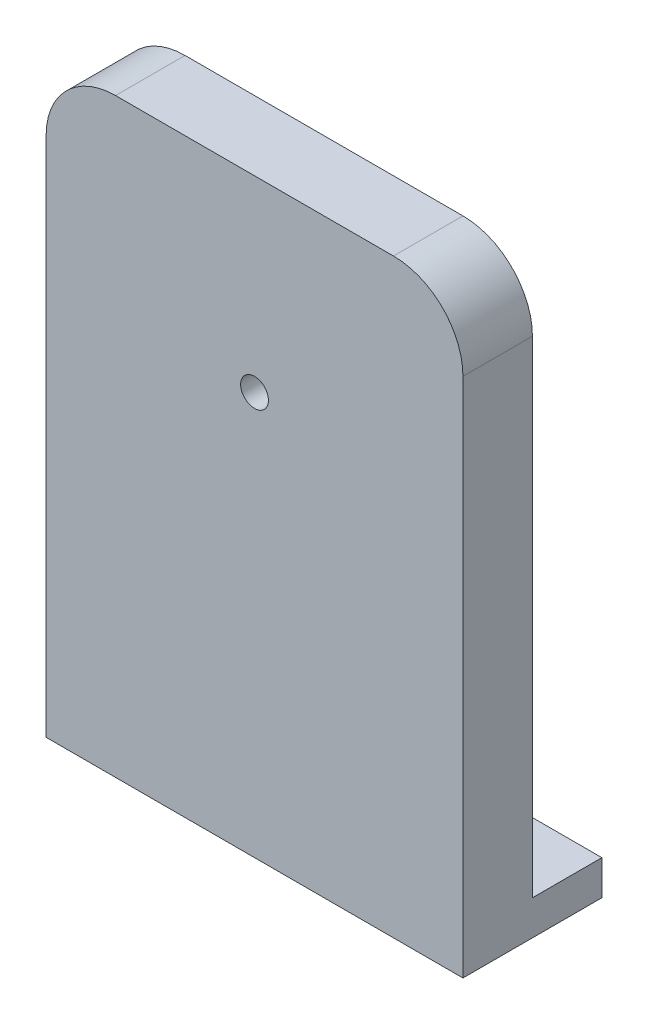
ISO-10303-21;
HEADER;
FILE_DESCRIPTION(('STEP AP214'),'2;1');
FILE_NAME('part.step','',(''),(''),'','','');
FILE_SCHEMA(('AUTOMOTIVE_DESIGN { 1 0 10303 214 1 1 1 1 }'));
ENDSEC;
DATA;
#1=APPLICATION_CONTEXT('core data for automotive mechanical design processes');
#2=APPLICATION_PROTOCOL_DEFINITION('international standard','automotive_design',2000,#1);
#3=PRODUCT_CONTEXT('',#1,'mechanical');
#4=PRODUCT('Part','Part','',(#3));
#5=PRODUCT_RELATED_PRODUCT_CATEGORY('part','',(#4));
#6=PRODUCT_DEFINITION_FORMATION('','',#4);
#7=PRODUCT_DEFINITION_CONTEXT('part definition',#1,'design');
#8=PRODUCT_DEFINITION('design','',#6,#7);
#9=PRODUCT_DEFINITION_SHAPE('','',#8);
#10=(LENGTH_UNIT() NAMED_UNIT(*) SI_UNIT(.MILLI.,.METRE.));
#11=(NAMED_UNIT(*) PLANE_ANGLE_UNIT() SI_UNIT($,.RADIAN.));
#12=(NAMED_UNIT(*) SI_UNIT($,.STERADIAN.) SOLID_ANGLE_UNIT());
#13=UNCERTAINTY_MEASURE_WITH_UNIT(LENGTH_MEASURE(1.E-05),#10,'distance_accuracy_value','');
#14=(GEOMETRIC_REPRESENTATION_CONTEXT(3) GLOBAL_UNCERTAINTY_ASSIGNED_CONTEXT((#13)) GLOBAL_UNIT_ASSIGNED_CONTEXT((#10,
#11,#12)) REPRESENTATION_CONTEXT('',''));
#15=CARTESIAN_POINT('',(0.,0.,0.));
#16=DIRECTION('',(0.,0.,1.));
#17=DIRECTION('',(1.,0.,0.));
#18=AXIS2_PLACEMENT_3D('',#15,#16,#17);
#19=CARTESIAN_POINT('',(0.,5.,0.));
#20=DIRECTION('',(0.,1.,0.));
#21=DIRECTION('',(0.,0.,1.));
#22=AXIS2_PLACEMENT_3D('',#19,#20,#21);
#23=PLANE('',#22);
#24=DIRECTION('',(-1.,0.,0.));
#25=VECTOR('',#24,1.);
#26=CARTESIAN_POINT('',(-30.,5.,0.));
#27=LINE('',#26,#25);
#28=CARTESIAN_POINT('',(30.,5.,0.));
#29=VERTEX_POINT('',#28);
#30=CARTESIAN_POINT('',(-30.,5.,0.));
#31=VERTEX_POINT('',#30);
#32=EDGE_CURVE('E162',#29,#31,#27,.T.);
#33=ORIENTED_EDGE('',*,*,#32,.F.);
#34=DIRECTION('',(0.,0.,-1.));
#35=VECTOR('',#34,1.);
#36=CARTESIAN_POINT('',(30.,5.,-10.));
#37=LINE('',#36,#35);
#38=CARTESIAN_POINT('',(30.,5.,-10.));
#39=VERTEX_POINT('',#38);
#40=EDGE_CURVE('E253',#29,#39,#37,.T.);
#41=ORIENTED_EDGE('',*,*,#40,.T.);
#42=DIRECTION('',(-1.,0.,0.));
#43=VECTOR('',#42,1.);
#44=CARTESIAN_POINT('',(-30.,5.,-10.));
#45=LINE('',#44,#43);
#46=CARTESIAN_POINT('',(-30.,5.,-10.));
#47=VERTEX_POINT('',#46);
#48=EDGE_CURVE('E165',#39,#47,#45,.T.);
#49=ORIENTED_EDGE('',*,*,#48,.T.);
#50=DIRECTION('',(0.,0.,1.));
#51=VECTOR('',#50,1.);
#52=CARTESIAN_POINT('',(-30.,5.,-10.));
#53=LINE('',#52,#51);
#54=EDGE_CURVE('E151',#47,#31,#53,.T.);
#55=ORIENTED_EDGE('',*,*,#54,.T.);
#56=EDGE_LOOP('',(#33,#41,#49,#55));
#57=FACE_BOUND('',#56,.T.);
#58=DIRECTION('',(1.,0.,0.));
#59=VECTOR('',#58,1.);
#60=CARTESIAN_POINT('',(-16.8,5.,-1.6));
#61=LINE('',#60,#59);
#62=CARTESIAN_POINT('',(-16.8,5.,-1.6));
#63=VERTEX_POINT('',#62);
#64=CARTESIAN_POINT('',(-5.,5.,-1.6));
#65=VERTEX_POINT('',#64);
#66=EDGE_CURVE('E222',#63,#65,#61,.T.);
#67=ORIENTED_EDGE('',*,*,#66,.F.);
#68=CARTESIAN_POINT('',(-16.8,5.,-5.));
#69=DIRECTION('',(0.,1.,0.));
#70=DIRECTION('',(0.,0.,1.));
#71=AXIS2_PLACEMENT_3D('',#68,#69,#70);
#72=CIRCLE('',#71,3.4);
#73=CARTESIAN_POINT('',(-16.8,5.,-8.4));
#74=VERTEX_POINT('',#73);
#75=EDGE_CURVE('E220',#74,#63,#72,.T.);
#76=ORIENTED_EDGE('',*,*,#75,.F.);
#77=DIRECTION('',(-1.,0.,0.));
#78=VECTOR('',#77,1.);
#79=CARTESIAN_POINT('',(-16.8,5.,-8.4));
#80=LINE('',#79,#78);
#81=CARTESIAN_POINT('',(-5.,5.,-8.4));
#82=VERTEX_POINT('',#81);
#83=EDGE_CURVE('E228',#82,#74,#80,.T.);
#84=ORIENTED_EDGE('',*,*,#83,.F.);
#85=CARTESIAN_POINT('',(-5.,5.,-5.));
#86=DIRECTION('',(0.,1.,0.));
#87=DIRECTION('',(0.,0.,1.));
#88=AXIS2_PLACEMENT_3D('',#85,#86,#87);
#89=CIRCLE('',#88,3.4);
#90=EDGE_CURVE('E225',#65,#82,#89,.T.);
#91=ORIENTED_EDGE('',*,*,#90,.F.);
#92=EDGE_LOOP('',(#67,#76,#84,#91));
#93=FACE_BOUND('',#92,.T.);
#94=DIRECTION('',(1.,0.,0.));
#95=VECTOR('',#94,1.);
#96=CARTESIAN_POINT('',(3.19999999999999,5.,-1.6));
#97=LINE('',#96,#95);
#98=CARTESIAN_POINT('',(3.19999999999999,5.,-1.6));
#99=VERTEX_POINT('',#98);
#100=CARTESIAN_POINT('',(15.,5.,-1.6));
#101=VERTEX_POINT('',#100);
#102=EDGE_CURVE('E190',#99,#101,#97,.T.);
#103=ORIENTED_EDGE('',*,*,#102,.F.);
#104=CARTESIAN_POINT('',(3.19999999999999,5.,-5.));
#105=DIRECTION('',(0.,1.,0.));
#106=DIRECTION('',(0.,0.,1.));
#107=AXIS2_PLACEMENT_3D('',#104,#105,#106);
#108=CIRCLE('',#107,3.4);
#109=CARTESIAN_POINT('',(3.19999999999999,5.,-8.4));
#110=VERTEX_POINT('',#109);
#111=EDGE_CURVE('E188',#110,#99,#108,.T.);
#112=ORIENTED_EDGE('',*,*,#111,.F.);
#113=DIRECTION('',(-1.,0.,0.));
#114=VECTOR('',#113,1.);
#115=CARTESIAN_POINT('',(3.19999999999999,5.,-8.4));
#116=LINE('',#115,#114);
#117=CARTESIAN_POINT('',(15.,5.,-8.4));
#118=VERTEX_POINT('',#117);
#119=EDGE_CURVE('E196',#118,#110,#116,.T.);
#120=ORIENTED_EDGE('',*,*,#119,.F.);
#121=CARTESIAN_POINT('',(15.,5.,-5.));
#122=DIRECTION('',(0.,1.,0.));
#123=DIRECTION('',(0.,0.,1.));
#124=AXIS2_PLACEMENT_3D('',#121,#122,#123);
#125=CIRCLE('',#124,3.4);
#126=EDGE_CURVE('E193',#101,#118,#125,.T.);
#127=ORIENTED_EDGE('',*,*,#126,.F.);
#128=EDGE_LOOP('',(#103,#112,#120,#127));
#129=FACE_BOUND('',#128,.T.);
#130=ADVANCED_FACE('F34',(#57,#93,#129),#23,.T.);
#131=CARTESIAN_POINT('',(0.,0.,0.));
#132=DIRECTION('',(0.,1.,0.));
#133=DIRECTION('',(0.,0.,1.));
#134=AXIS2_PLACEMENT_3D('',#131,#132,#133);
#135=PLANE('',#134);
#136=CARTESIAN_POINT('',(-16.8,0.,-5.));
#137=DIRECTION('',(0.,1.,0.));
#138=DIRECTION('',(0.,0.,1.));
#139=AXIS2_PLACEMENT_3D('',#136,#137,#138);
#140=CIRCLE('',#139,3.4);
#141=CARTESIAN_POINT('',(-16.8,0.,-8.4));
#142=VERTEX_POINT('',#141);
#143=CARTESIAN_POINT('',(-16.8,0.,-1.6));
#144=VERTEX_POINT('',#143);
#145=EDGE_CURVE('E219',#142,#144,#140,.T.);
#146=ORIENTED_EDGE('',*,*,#145,.T.);
#147=DIRECTION('',(1.,0.,0.));
#148=VECTOR('',#147,1.);
#149=CARTESIAN_POINT('',(-16.8,0.,-1.6));
#150=LINE('',#149,#148);
#151=CARTESIAN_POINT('',(-5.,0.,-1.6));
#152=VERTEX_POINT('',#151);
#153=EDGE_CURVE('E233',#144,#152,#150,.T.);
#154=ORIENTED_EDGE('',*,*,#153,.T.);
#155=CARTESIAN_POINT('',(-5.,0.,-5.));
#156=DIRECTION('',(0.,1.,0.));
#157=DIRECTION('',(0.,0.,1.));
#158=AXIS2_PLACEMENT_3D('',#155,#156,#157);
#159=CIRCLE('',#158,3.4);
#160=CARTESIAN_POINT('',(-5.,0.,-8.4));
#161=VERTEX_POINT('',#160);
#162=EDGE_CURVE('E236',#152,#161,#159,.T.);
#163=ORIENTED_EDGE('',*,*,#162,.T.);
#164=DIRECTION('',(-1.,0.,0.));
#165=VECTOR('',#164,1.);
#166=CARTESIAN_POINT('',(-16.8,0.,-8.4));
#167=LINE('',#166,#165);
#168=EDGE_CURVE('E223',#161,#142,#167,.T.);
#169=ORIENTED_EDGE('',*,*,#168,.T.);
#170=EDGE_LOOP('',(#146,#154,#163,#169));
#171=FACE_BOUND('',#170,.T.);
#172=DIRECTION('',(0.,0.,-1.));
#173=VECTOR('',#172,1.);
#174=CARTESIAN_POINT('',(30.,0.,-10.));
#175=LINE('',#174,#173);
#176=CARTESIAN_POINT('',(30.,0.,10.));
#177=VERTEX_POINT('',#176);
#178=CARTESIAN_POINT('',(30.,0.,-10.));
#179=VERTEX_POINT('',#178);
#180=EDGE_CURVE('E250',#177,#179,#175,.T.);
#181=ORIENTED_EDGE('',*,*,#180,.F.);
#182=DIRECTION('',(1.,0.,0.));
#183=VECTOR('',#182,1.);
#184=CARTESIAN_POINT('',(-30.,0.,10.));
#185=LINE('',#184,#183);
#186=CARTESIAN_POINT('',(-30.,0.,10.));
#187=VERTEX_POINT('',#186);
#188=EDGE_CURVE('E255',#187,#177,#185,.T.);
#189=ORIENTED_EDGE('',*,*,#188,.F.);
#190=DIRECTION('',(0.,0.,1.));
#191=VECTOR('',#190,1.);
#192=CARTESIAN_POINT('',(-30.,0.,-10.));
#193=LINE('',#192,#191);
#194=CARTESIAN_POINT('',(-30.,0.,-10.));
#195=VERTEX_POINT('',#194);
#196=EDGE_CURVE('E267',#195,#187,#193,.T.);
#197=ORIENTED_EDGE('',*,*,#196,.F.);
#198=DIRECTION('',(-1.,0.,0.));
#199=VECTOR('',#198,1.);
#200=CARTESIAN_POINT('',(-30.,0.,-10.));
#201=LINE('',#200,#199);
#202=EDGE_CURVE('E270',#179,#195,#201,.T.);
#203=ORIENTED_EDGE('',*,*,#202,.F.);
#204=EDGE_LOOP('',(#181,#189,#197,#203));
#205=FACE_BOUND('',#204,.T.);
#206=CARTESIAN_POINT('',(3.19999999999999,0.,-5.));
#207=DIRECTION('',(0.,1.,0.));
#208=DIRECTION('',(0.,0.,1.));
#209=AXIS2_PLACEMENT_3D('',#206,#207,#208);
#210=CIRCLE('',#209,3.4);
#211=CARTESIAN_POINT('',(3.19999999999999,0.,-8.4));
#212=VERTEX_POINT('',#211);
#213=CARTESIAN_POINT('',(3.19999999999999,0.,-1.6));
#214=VERTEX_POINT('',#213);
#215=EDGE_CURVE('E199',#212,#214,#210,.T.);
#216=ORIENTED_EDGE('',*,*,#215,.T.);
#217=DIRECTION('',(1.,0.,0.));
#218=VECTOR('',#217,1.);
#219=CARTESIAN_POINT('',(3.19999999999999,0.,-1.6));
#220=LINE('',#219,#218);
#221=CARTESIAN_POINT('',(15.,0.,-1.6));
#222=VERTEX_POINT('',#221);
#223=EDGE_CURVE('E202',#214,#222,#220,.T.);
#224=ORIENTED_EDGE('',*,*,#223,.T.);
#225=CARTESIAN_POINT('',(15.,0.,-5.));
#226=DIRECTION('',(0.,1.,0.));
#227=DIRECTION('',(0.,0.,1.));
#228=AXIS2_PLACEMENT_3D('',#225,#226,#227);
#229=CIRCLE('',#228,3.4);
#230=CARTESIAN_POINT('',(15.,0.,-8.4));
#231=VERTEX_POINT('',#230);
#232=EDGE_CURVE('E205',#222,#231,#229,.T.);
#233=ORIENTED_EDGE('',*,*,#232,.T.);
#234=DIRECTION('',(-1.,0.,0.));
#235=VECTOR('',#234,1.);
#236=CARTESIAN_POINT('',(3.19999999999999,0.,-8.4));
#237=LINE('',#236,#235);
#238=EDGE_CURVE('E191',#231,#212,#237,.T.);
#239=ORIENTED_EDGE('',*,*,#238,.T.);
#240=EDGE_LOOP('',(#216,#224,#233,#239));
#241=FACE_BOUND('',#240,.T.);
#242=ADVANCED_FACE('F279',(#171,#205,#241),#135,.F.);
#243=CARTESIAN_POINT('',(30.,5.,-10.));
#244=DIRECTION('',(-1.,0.,0.));
#245=DIRECTION('',(0.,0.,1.));
#246=AXIS2_PLACEMENT_3D('',#243,#244,#245);
#247=PLANE('',#246);
#248=DIRECTION('',(0.,-1.,0.));
#249=VECTOR('',#248,1.);
#250=CARTESIAN_POINT('',(30.,85.,0.));
#251=LINE('',#250,#249);
#252=CARTESIAN_POINT('',(30.,75.,0.));
#253=VERTEX_POINT('',#252);
#254=EDGE_CURVE('E156',#253,#29,#251,.T.);
#255=ORIENTED_EDGE('',*,*,#254,.F.);
#256=DIRECTION('',(0.,0.,-1.));
#257=VECTOR('',#256,1.);
#258=CARTESIAN_POINT('',(30.,75.,-10.));
#259=LINE('',#258,#257);
#260=CARTESIAN_POINT('',(30.,75.,10.));
#261=VERTEX_POINT('',#260);
#262=EDGE_CURVE('E57',#253,#261,#259,.F.);
#263=ORIENTED_EDGE('',*,*,#262,.T.);
#264=DIRECTION('',(0.,-1.,0.));
#265=VECTOR('',#264,1.);
#266=CARTESIAN_POINT('',(30.,5.,10.));
#267=LINE('',#266,#265);
#268=EDGE_CURVE('E167',#261,#177,#267,.T.);
#269=ORIENTED_EDGE('',*,*,#268,.T.);
#270=ORIENTED_EDGE('',*,*,#180,.T.);
#271=DIRECTION('',(0.,-1.,0.));
#272=VECTOR('',#271,1.);
#273=CARTESIAN_POINT('',(30.,5.,-10.));
#274=LINE('',#273,#272);
#275=EDGE_CURVE('E256',#39,#179,#274,.T.);
#276=ORIENTED_EDGE('',*,*,#275,.F.);
#277=ORIENTED_EDGE('',*,*,#40,.F.);
#278=EDGE_LOOP('',(#255,#263,#269,#270,#276,#277));
#279=FACE_BOUND('',#278,.T.);
#280=ADVANCED_FACE('F276',(#279),#247,.F.);
#281=CARTESIAN_POINT('',(-30.,5.,-10.));
#282=DIRECTION('',(0.,0.,1.));
#283=DIRECTION('',(1.,0.,0.));
#284=AXIS2_PLACEMENT_3D('',#281,#282,#283);
#285=PLANE('',#284);
#286=ORIENTED_EDGE('',*,*,#202,.T.);
#287=DIRECTION('',(0.,-1.,0.));
#288=VECTOR('',#287,1.);
#289=CARTESIAN_POINT('',(-30.,5.,-10.));
#290=LINE('',#289,#288);
#291=EDGE_CURVE('E260',#47,#195,#290,.T.);
#292=ORIENTED_EDGE('',*,*,#291,.F.);
#293=ORIENTED_EDGE('',*,*,#48,.F.);
#294=ORIENTED_EDGE('',*,*,#275,.T.);
#295=EDGE_LOOP('',(#286,#292,#293,#294));
#296=FACE_BOUND('',#295,.T.);
#297=ADVANCED_FACE('F283',(#296),#285,.F.);
#298=CARTESIAN_POINT('',(-30.,5.,-10.));
#299=DIRECTION('',(1.,0.,0.));
#300=DIRECTION('',(0.,0.,-1.));
#301=AXIS2_PLACEMENT_3D('',#298,#299,#300);
#302=PLANE('',#301);
#303=DIRECTION('',(0.,-1.,0.));
#304=VECTOR('',#303,1.);
#305=CARTESIAN_POINT('',(-30.,5.,10.));
#306=LINE('',#305,#304);
#307=CARTESIAN_POINT('',(-30.,75.,10.));
#308=VERTEX_POINT('',#307);
#309=EDGE_CURVE('E262',#308,#187,#306,.T.);
#310=ORIENTED_EDGE('',*,*,#309,.F.);
#311=DIRECTION('',(0.,0.,1.));
#312=VECTOR('',#311,1.);
#313=CARTESIAN_POINT('',(-30.,75.,-10.));
#314=LINE('',#313,#312);
#315=CARTESIAN_POINT('',(-30.,75.,0.));
#316=VERTEX_POINT('',#315);
#317=EDGE_CURVE('E11',#308,#316,#314,.F.);
#318=ORIENTED_EDGE('',*,*,#317,.T.);
#319=DIRECTION('',(0.,-1.,0.));
#320=VECTOR('',#319,1.);
#321=CARTESIAN_POINT('',(-30.,85.,0.));
#322=LINE('',#321,#320);
#323=EDGE_CURVE('E147',#316,#31,#322,.T.);
#324=ORIENTED_EDGE('',*,*,#323,.T.);
#325=ORIENTED_EDGE('',*,*,#54,.F.);
#326=ORIENTED_EDGE('',*,*,#291,.T.);
#327=ORIENTED_EDGE('',*,*,#196,.T.);
#328=EDGE_LOOP('',(#310,#318,#324,#325,#326,#327));
#329=FACE_BOUND('',#328,.T.);
#330=ADVANCED_FACE('F149',(#329),#302,.F.);
#331=CARTESIAN_POINT('',(-30.,5.,10.));
#332=DIRECTION('',(0.,0.,-1.));
#333=DIRECTION('',(-1.,0.,0.));
#334=AXIS2_PLACEMENT_3D('',#331,#332,#333);
#335=PLANE('',#334);
#336=CARTESIAN_POINT('',(0.,58.,10.));
#337=DIRECTION('',(0.,0.,-1.));
#338=DIRECTION('',(-1.,0.,0.));
#339=AXIS2_PLACEMENT_3D('',#336,#337,#338);
#340=CIRCLE('',#339,2.);
#341=CARTESIAN_POINT('',(-2.,58.,10.));
#342=VERTEX_POINT('',#341);
#343=EDGE_CURVE('E461',#342,#342,#340,.T.);
#344=ORIENTED_EDGE('',*,*,#343,.T.);
#345=EDGE_LOOP('',(#344));
#346=FACE_BOUND('',#345,.T.);
#347=ORIENTED_EDGE('',*,*,#268,.F.);
#348=CARTESIAN_POINT('',(20.,75.,10.));
#349=DIRECTION('',(0.,0.,-1.));
#350=DIRECTION('',(-1.,0.,0.));
#351=AXIS2_PLACEMENT_3D('',#348,#349,#350);
#352=CIRCLE('',#351,10.);
#353=CARTESIAN_POINT('',(20.,85.,10.));
#354=VERTEX_POINT('',#353);
#355=EDGE_CURVE('E42',#261,#354,#352,.F.);
#356=ORIENTED_EDGE('',*,*,#355,.T.);
#357=DIRECTION('',(1.,0.,0.));
#358=VECTOR('',#357,1.);
#359=CARTESIAN_POINT('',(30.,85.,10.));
#360=LINE('',#359,#358);
#361=CARTESIAN_POINT('',(-20.,85.,10.));
#362=VERTEX_POINT('',#361);
#363=EDGE_CURVE('E171',#362,#354,#360,.T.);
#364=ORIENTED_EDGE('',*,*,#363,.F.);
#365=CARTESIAN_POINT('',(-20.,75.,10.));
#366=DIRECTION('',(0.,0.,-1.));
#367=DIRECTION('',(-1.,0.,0.));
#368=AXIS2_PLACEMENT_3D('',#365,#366,#367);
#369=CIRCLE('',#368,10.);
#370=EDGE_CURVE('E49',#362,#308,#369,.F.);
#371=ORIENTED_EDGE('',*,*,#370,.T.);
#372=ORIENTED_EDGE('',*,*,#309,.T.);
#373=ORIENTED_EDGE('',*,*,#188,.T.);
#374=EDGE_LOOP('',(#347,#356,#364,#371,#372,#373));
#375=FACE_BOUND('',#374,.T.);
#376=ADVANCED_FACE('F299',(#346,#375),#335,.F.);
#377=CARTESIAN_POINT('',(-16.8,5.,-5.));
#378=DIRECTION('',(0.,-1.,0.));
#379=DIRECTION('',(0.,0.,-1.));
#380=AXIS2_PLACEMENT_3D('',#377,#378,#379);
#381=CYLINDRICAL_SURFACE('',#380,3.4);
#382=ORIENTED_EDGE('',*,*,#145,.F.);
#383=DIRECTION('',(0.,-1.,0.));
#384=VECTOR('',#383,1.);
#385=CARTESIAN_POINT('',(-16.8,5.,-8.4));
#386=LINE('',#385,#384);
#387=EDGE_CURVE('E230',#74,#142,#386,.T.);
#388=ORIENTED_EDGE('',*,*,#387,.F.);
#389=ORIENTED_EDGE('',*,*,#75,.T.);
#390=DIRECTION('',(0.,-1.,0.));
#391=VECTOR('',#390,1.);
#392=CARTESIAN_POINT('',(-16.8,5.,-1.6));
#393=LINE('',#392,#391);
#394=EDGE_CURVE('E247',#63,#144,#393,.T.);
#395=ORIENTED_EDGE('',*,*,#394,.T.);
#396=EDGE_LOOP('',(#382,#388,#389,#395));
#397=FACE_BOUND('',#396,.T.);
#398=ADVANCED_FACE('F324',(#397),#381,.F.);
#399=CARTESIAN_POINT('',(-16.8,5.,-1.6));
#400=DIRECTION('',(0.,0.,-1.));
#401=DIRECTION('',(-1.,0.,0.));
#402=AXIS2_PLACEMENT_3D('',#399,#400,#401);
#403=PLANE('',#402);
#404=ORIENTED_EDGE('',*,*,#153,.F.);
#405=ORIENTED_EDGE('',*,*,#394,.F.);
#406=ORIENTED_EDGE('',*,*,#66,.T.);
#407=DIRECTION('',(0.,-1.,0.));
#408=VECTOR('',#407,1.);
#409=CARTESIAN_POINT('',(-5.,5.,-1.6));
#410=LINE('',#409,#408);
#411=EDGE_CURVE('E245',#65,#152,#410,.T.);
#412=ORIENTED_EDGE('',*,*,#411,.T.);
#413=EDGE_LOOP('',(#404,#405,#406,#412));
#414=FACE_BOUND('',#413,.T.);
#415=ADVANCED_FACE('F360',(#414),#403,.T.);
#416=CARTESIAN_POINT('',(-5.,5.,-5.));
#417=DIRECTION('',(0.,-1.,0.));
#418=DIRECTION('',(0.,0.,-1.));
#419=AXIS2_PLACEMENT_3D('',#416,#417,#418);
#420=CYLINDRICAL_SURFACE('',#419,3.4);
#421=ORIENTED_EDGE('',*,*,#162,.F.);
#422=ORIENTED_EDGE('',*,*,#411,.F.);
#423=ORIENTED_EDGE('',*,*,#90,.T.);
#424=DIRECTION('',(0.,-1.,0.));
#425=VECTOR('',#424,1.);
#426=CARTESIAN_POINT('',(-5.,5.,-8.4));
#427=LINE('',#426,#425);
#428=EDGE_CURVE('E243',#82,#161,#427,.T.);
#429=ORIENTED_EDGE('',*,*,#428,.T.);
#430=EDGE_LOOP('',(#421,#422,#423,#429));
#431=FACE_BOUND('',#430,.T.);
#432=ADVANCED_FACE('F367',(#431),#420,.F.);
#433=CARTESIAN_POINT('',(-16.8,5.,-8.4));
#434=DIRECTION('',(0.,0.,1.));
#435=DIRECTION('',(1.,0.,0.));
#436=AXIS2_PLACEMENT_3D('',#433,#434,#435);
#437=PLANE('',#436);
#438=ORIENTED_EDGE('',*,*,#168,.F.);
#439=ORIENTED_EDGE('',*,*,#428,.F.);
#440=ORIENTED_EDGE('',*,*,#83,.T.);
#441=ORIENTED_EDGE('',*,*,#387,.T.);
#442=EDGE_LOOP('',(#438,#439,#440,#441));
#443=FACE_BOUND('',#442,.T.);
#444=ADVANCED_FACE('F374',(#443),#437,.T.);
#445=CARTESIAN_POINT('',(3.19999999999999,5.,-5.));
#446=DIRECTION('',(0.,-1.,0.));
#447=DIRECTION('',(0.,0.,-1.));
#448=AXIS2_PLACEMENT_3D('',#445,#446,#447);
#449=CYLINDRICAL_SURFACE('',#448,3.4);
#450=ORIENTED_EDGE('',*,*,#215,.F.);
#451=DIRECTION('',(0.,-1.,0.));
#452=VECTOR('',#451,1.);
#453=CARTESIAN_POINT('',(3.19999999999999,5.,-8.4));
#454=LINE('',#453,#452);
#455=EDGE_CURVE('E198',#110,#212,#454,.T.);
#456=ORIENTED_EDGE('',*,*,#455,.F.);
#457=ORIENTED_EDGE('',*,*,#111,.T.);
#458=DIRECTION('',(0.,-1.,0.));
#459=VECTOR('',#458,1.);
#460=CARTESIAN_POINT('',(3.19999999999999,5.,-1.6));
#461=LINE('',#460,#459);
#462=EDGE_CURVE('E216',#99,#214,#461,.T.);
#463=ORIENTED_EDGE('',*,*,#462,.T.);
#464=EDGE_LOOP('',(#450,#456,#457,#463));
#465=FACE_BOUND('',#464,.T.);
#466=ADVANCED_FACE('F382',(#465),#449,.F.);
#467=CARTESIAN_POINT('',(3.19999999999999,5.,-1.6));
#468=DIRECTION('',(0.,0.,-1.));
#469=DIRECTION('',(-1.,0.,0.));
#470=AXIS2_PLACEMENT_3D('',#467,#468,#469);
#471=PLANE('',#470);
#472=ORIENTED_EDGE('',*,*,#223,.F.);
#473=ORIENTED_EDGE('',*,*,#462,.F.);
#474=ORIENTED_EDGE('',*,*,#102,.T.);
#475=DIRECTION('',(0.,-1.,0.));
#476=VECTOR('',#475,1.);
#477=CARTESIAN_POINT('',(15.,5.,-1.6));
#478=LINE('',#477,#476);
#479=EDGE_CURVE('E214',#101,#222,#478,.T.);
#480=ORIENTED_EDGE('',*,*,#479,.T.);
#481=EDGE_LOOP('',(#472,#473,#474,#480));
#482=FACE_BOUND('',#481,.T.);
#483=ADVANCED_FACE('F390',(#482),#471,.T.);
#484=CARTESIAN_POINT('',(15.,5.,-5.));
#485=DIRECTION('',(0.,-1.,0.));
#486=DIRECTION('',(0.,0.,-1.));
#487=AXIS2_PLACEMENT_3D('',#484,#485,#486);
#488=CYLINDRICAL_SURFACE('',#487,3.4);
#489=ORIENTED_EDGE('',*,*,#232,.F.);
#490=ORIENTED_EDGE('',*,*,#479,.F.);
#491=ORIENTED_EDGE('',*,*,#126,.T.);
#492=DIRECTION('',(0.,-1.,0.));
#493=VECTOR('',#492,1.);
#494=CARTESIAN_POINT('',(15.,5.,-8.4));
#495=LINE('',#494,#493);
#496=EDGE_CURVE('E212',#118,#231,#495,.T.);
#497=ORIENTED_EDGE('',*,*,#496,.T.);
#498=EDGE_LOOP('',(#489,#490,#491,#497));
#499=FACE_BOUND('',#498,.T.);
#500=ADVANCED_FACE('F398',(#499),#488,.F.);
#501=CARTESIAN_POINT('',(3.19999999999999,5.,-8.4));
#502=DIRECTION('',(0.,0.,1.));
#503=DIRECTION('',(1.,0.,0.));
#504=AXIS2_PLACEMENT_3D('',#501,#502,#503);
#505=PLANE('',#504);
#506=ORIENTED_EDGE('',*,*,#238,.F.);
#507=ORIENTED_EDGE('',*,*,#496,.F.);
#508=ORIENTED_EDGE('',*,*,#119,.T.);
#509=ORIENTED_EDGE('',*,*,#455,.T.);
#510=EDGE_LOOP('',(#506,#507,#508,#509));
#511=FACE_BOUND('',#510,.T.);
#512=ADVANCED_FACE('F406',(#511),#505,.T.);
#513=CARTESIAN_POINT('',(-30.,85.,0.));
#514=DIRECTION('',(0.,0.,1.));
#515=DIRECTION('',(1.,0.,0.));
#516=AXIS2_PLACEMENT_3D('',#513,#514,#515);
#517=PLANE('',#516);
#518=CARTESIAN_POINT('',(0.,58.,0.));
#519=DIRECTION('',(0.,0.,-1.));
#520=DIRECTION('',(-1.,0.,0.));
#521=AXIS2_PLACEMENT_3D('',#518,#519,#520);
#522=CIRCLE('',#521,7.5);
#523=CARTESIAN_POINT('',(-7.5,58.,0.));
#524=VERTEX_POINT('',#523);
#525=EDGE_CURVE('E177',#524,#524,#522,.T.);
#526=ORIENTED_EDGE('',*,*,#525,.F.);
#527=EDGE_LOOP('',(#526));
#528=FACE_BOUND('',#527,.T.);
#529=DIRECTION('',(-1.,0.,0.));
#530=VECTOR('',#529,1.);
#531=CARTESIAN_POINT('',(-30.,85.,0.));
#532=LINE('',#531,#530);
#533=CARTESIAN_POINT('',(20.,85.,0.));
#534=VERTEX_POINT('',#533);
#535=CARTESIAN_POINT('',(-20.,85.,0.));
#536=VERTEX_POINT('',#535);
#537=EDGE_CURVE('E157',#534,#536,#532,.T.);
#538=ORIENTED_EDGE('',*,*,#537,.F.);
#539=CARTESIAN_POINT('',(20.,75.,0.));
#540=DIRECTION('',(0.,0.,1.));
#541=DIRECTION('',(1.,0.,0.));
#542=AXIS2_PLACEMENT_3D('',#539,#540,#541);
#543=CIRCLE('',#542,10.);
#544=EDGE_CURVE('E289',#534,#253,#543,.F.);
#545=ORIENTED_EDGE('',*,*,#544,.T.);
#546=ORIENTED_EDGE('',*,*,#254,.T.);
#547=ORIENTED_EDGE('',*,*,#32,.T.);
#548=ORIENTED_EDGE('',*,*,#323,.F.);
#549=CARTESIAN_POINT('',(-20.,75.,0.));
#550=DIRECTION('',(0.,0.,1.));
#551=DIRECTION('',(1.,0.,0.));
#552=AXIS2_PLACEMENT_3D('',#549,#550,#551);
#553=CIRCLE('',#552,10.);
#554=EDGE_CURVE('E287',#316,#536,#553,.F.);
#555=ORIENTED_EDGE('',*,*,#554,.T.);
#556=EDGE_LOOP('',(#538,#545,#546,#547,#548,#555));
#557=FACE_BOUND('',#556,.T.);
#558=ADVANCED_FACE('F170',(#528,#557),#517,.F.);
#559=CARTESIAN_POINT('',(0.,85.,0.));
#560=DIRECTION('',(0.,-1.,0.));
#561=DIRECTION('',(0.,0.,-1.));
#562=AXIS2_PLACEMENT_3D('',#559,#560,#561);
#563=PLANE('',#562);
#564=ORIENTED_EDGE('',*,*,#363,.T.);
#565=DIRECTION('',(0.,0.,-1.));
#566=VECTOR('',#565,1.);
#567=CARTESIAN_POINT('',(20.,85.,0.));
#568=LINE('',#567,#566);
#569=EDGE_CURVE('E290',#354,#534,#568,.T.);
#570=ORIENTED_EDGE('',*,*,#569,.T.);
#571=ORIENTED_EDGE('',*,*,#537,.T.);
#572=DIRECTION('',(0.,0.,1.));
#573=VECTOR('',#572,1.);
#574=CARTESIAN_POINT('',(-20.,85.,0.));
#575=LINE('',#574,#573);
#576=EDGE_CURVE('E259',#536,#362,#575,.T.);
#577=ORIENTED_EDGE('',*,*,#576,.T.);
#578=EDGE_LOOP('',(#564,#570,#571,#577));
#579=FACE_BOUND('',#578,.T.);
#580=ADVANCED_FACE('F303',(#579),#563,.F.);
#581=CARTESIAN_POINT('',(0.,58.,5.));
#582=DIRECTION('',(0.,0.,-1.));
#583=DIRECTION('',(-1.,0.,0.));
#584=AXIS2_PLACEMENT_3D('',#581,#582,#583);
#585=CYLINDRICAL_SURFACE('',#584,7.5);
#586=CARTESIAN_POINT('',(0.,58.,5.));
#587=DIRECTION('',(0.,0.,-1.));
#588=DIRECTION('',(-1.,0.,0.));
#589=AXIS2_PLACEMENT_3D('',#586,#587,#588);
#590=CIRCLE('',#589,7.5);
#591=CARTESIAN_POINT('',(-7.5,58.,5.));
#592=VERTEX_POINT('',#591);
#593=EDGE_CURVE('E172',#592,#592,#590,.T.);
#594=ORIENTED_EDGE('',*,*,#593,.F.);
#595=EDGE_LOOP('',(#594));
#596=FACE_BOUND('',#595,.T.);
#597=ORIENTED_EDGE('',*,*,#525,.T.);
#598=EDGE_LOOP('',(#597));
#599=FACE_BOUND('',#598,.T.);
#600=ADVANCED_FACE('F312',(#596,#599),#585,.F.);
#601=CARTESIAN_POINT('',(0.,58.,5.));
#602=DIRECTION('',(0.,0.,-1.));
#603=DIRECTION('',(-1.,0.,0.));
#604=AXIS2_PLACEMENT_3D('',#601,#602,#603);
#605=PLANE('',#604);
#606=CARTESIAN_POINT('',(0.,58.,5.));
#607=DIRECTION('',(0.,0.,-1.));
#608=DIRECTION('',(-1.,0.,0.));
#609=AXIS2_PLACEMENT_3D('',#606,#607,#608);
#610=CIRCLE('',#609,2.);
#611=CARTESIAN_POINT('',(-2.,58.,5.));
#612=VERTEX_POINT('',#611);
#613=EDGE_CURVE('E464',#612,#612,#610,.T.);
#614=ORIENTED_EDGE('',*,*,#613,.F.);
#615=EDGE_LOOP('',(#614));
#616=FACE_BOUND('',#615,.T.);
#617=ORIENTED_EDGE('',*,*,#593,.T.);
#618=EDGE_LOOP('',(#617));
#619=FACE_BOUND('',#618,.T.);
#620=ADVANCED_FACE('F306',(#616,#619),#605,.T.);
#621=CARTESIAN_POINT('',(20.,75.,0.));
#622=DIRECTION('',(0.,0.,-1.));
#623=DIRECTION('',(-1.,0.,0.));
#624=AXIS2_PLACEMENT_3D('',#621,#622,#623);
#625=CYLINDRICAL_SURFACE('',#624,10.);
#626=ORIENTED_EDGE('',*,*,#355,.F.);
#627=ORIENTED_EDGE('',*,*,#262,.F.);
#628=ORIENTED_EDGE('',*,*,#544,.F.);
#629=ORIENTED_EDGE('',*,*,#569,.F.);
#630=EDGE_LOOP('',(#626,#627,#628,#629));
#631=FACE_BOUND('',#630,.T.);
#632=ADVANCED_FACE('F304',(#631),#625,.T.);
#633=CARTESIAN_POINT('',(-20.,75.,0.));
#634=DIRECTION('',(0.,0.,1.));
#635=DIRECTION('',(1.,0.,0.));
#636=AXIS2_PLACEMENT_3D('',#633,#634,#635);
#637=CYLINDRICAL_SURFACE('',#636,10.);
#638=ORIENTED_EDGE('',*,*,#554,.F.);
#639=ORIENTED_EDGE('',*,*,#317,.F.);
#640=ORIENTED_EDGE('',*,*,#370,.F.);
#641=ORIENTED_EDGE('',*,*,#576,.F.);
#642=EDGE_LOOP('',(#638,#639,#640,#641));
#643=FACE_BOUND('',#642,.T.);
#644=ADVANCED_FACE('F36',(#643),#637,.T.);
#645=CARTESIAN_POINT('',(0.,58.,10.));
#646=DIRECTION('',(0.,0.,-1.));
#647=DIRECTION('',(-1.,0.,0.));
#648=AXIS2_PLACEMENT_3D('',#645,#646,#647);
#649=CYLINDRICAL_SURFACE('',#648,2.);
#650=ORIENTED_EDGE('',*,*,#343,.F.);
#651=EDGE_LOOP('',(#650));
#652=FACE_BOUND('',#651,.T.);
#653=ORIENTED_EDGE('',*,*,#613,.T.);
#654=EDGE_LOOP('',(#653));
#655=FACE_BOUND('',#654,.T.);
#656=ADVANCED_FACE('F311',(#652,#655),#649,.F.);
#657=CLOSED_SHELL('',(#130,#242,#280,#297,#330,#376,#398,#415,#432,#444,#466,#483,#500,#512,
#558,#580,#600,#620,#632,#644,#656));
#658=MANIFOLD_SOLID_BREP('B2',#657);
#659=ADVANCED_BREP_SHAPE_REPRESENTATION('',(#18,#658),#14);
#660=SHAPE_DEFINITION_REPRESENTATION(#9,#659);
ENDSEC;
END-ISO-10303-21;
